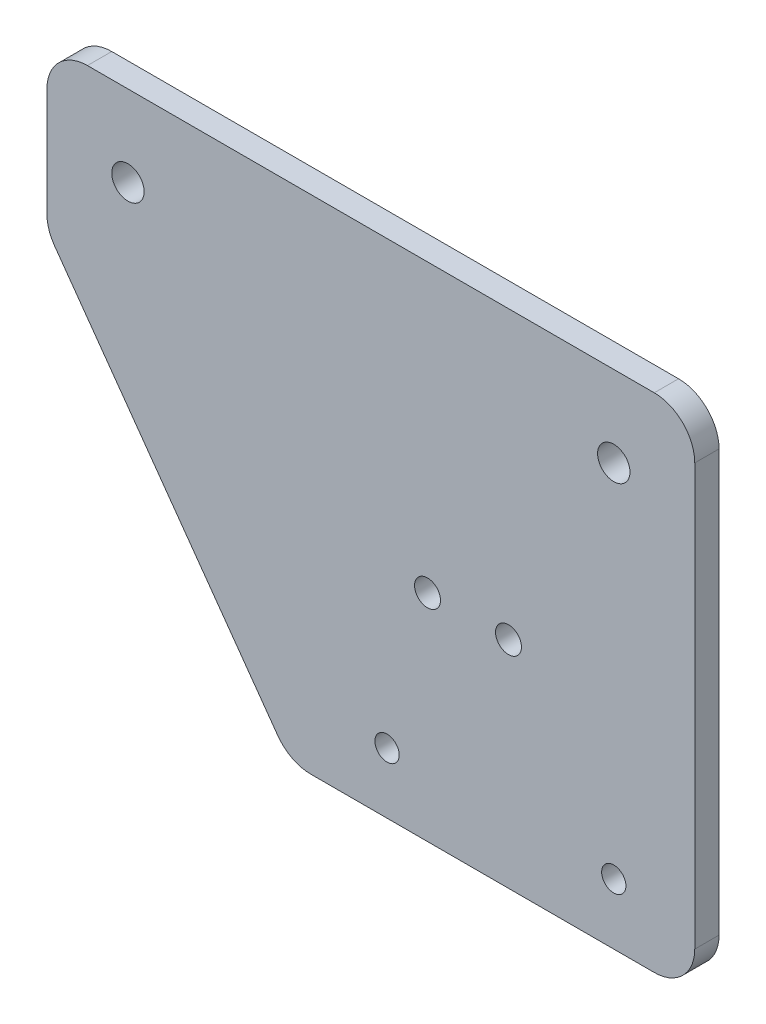
ISO-10303-21;
HEADER;
FILE_DESCRIPTION(('STEP AP214'),'2;1');
FILE_NAME('part.step','',(''),(''),'','','');
FILE_SCHEMA(('AUTOMOTIVE_DESIGN { 1 0 10303 214 1 1 1 1 }'));
ENDSEC;
DATA;
#1=APPLICATION_CONTEXT('core data for automotive mechanical design processes');
#2=APPLICATION_PROTOCOL_DEFINITION('international standard','automotive_design',2000,#1);
#3=PRODUCT_CONTEXT('',#1,'mechanical');
#4=PRODUCT('Part','Part','',(#3));
#5=PRODUCT_RELATED_PRODUCT_CATEGORY('part','',(#4));
#6=PRODUCT_DEFINITION_FORMATION('','',#4);
#7=PRODUCT_DEFINITION_CONTEXT('part definition',#1,'design');
#8=PRODUCT_DEFINITION('design','',#6,#7);
#9=PRODUCT_DEFINITION_SHAPE('','',#8);
#10=(LENGTH_UNIT() NAMED_UNIT(*) SI_UNIT(.MILLI.,.METRE.));
#11=(NAMED_UNIT(*) PLANE_ANGLE_UNIT() SI_UNIT($,.RADIAN.));
#12=(NAMED_UNIT(*) SI_UNIT($,.STERADIAN.) SOLID_ANGLE_UNIT());
#13=UNCERTAINTY_MEASURE_WITH_UNIT(LENGTH_MEASURE(1.E-05),#10,'distance_accuracy_value','');
#14=(GEOMETRIC_REPRESENTATION_CONTEXT(3) GLOBAL_UNCERTAINTY_ASSIGNED_CONTEXT((#13)) GLOBAL_UNIT_ASSIGNED_CONTEXT((#10,
#11,#12)) REPRESENTATION_CONTEXT('',''));
#15=CARTESIAN_POINT('',(0.,0.,0.));
#16=DIRECTION('',(0.,0.,1.));
#17=DIRECTION('',(1.,0.,0.));
#18=AXIS2_PLACEMENT_3D('',#15,#16,#17);
#19=CARTESIAN_POINT('',(37.5,31.,3.));
#20=DIRECTION('',(-1.,0.,0.));
#21=DIRECTION('',(0.,0.,1.));
#22=AXIS2_PLACEMENT_3D('',#19,#20,#21);
#23=PLANE('',#22);
#24=DIRECTION('',(0.,1.,0.));
#25=VECTOR('',#24,1.);
#26=CARTESIAN_POINT('',(37.5,31.,0.));
#27=LINE('',#26,#25);
#28=CARTESIAN_POINT('',(37.5,-26.,0.));
#29=VERTEX_POINT('',#28);
#30=CARTESIAN_POINT('',(37.5,26.,0.));
#31=VERTEX_POINT('',#30);
#32=EDGE_CURVE('E147',#29,#31,#27,.T.);
#33=ORIENTED_EDGE('',*,*,#32,.T.);
#34=DIRECTION('',(0.,0.,-1.));
#35=VECTOR('',#34,1.);
#36=CARTESIAN_POINT('',(37.5,26.,3.));
#37=LINE('',#36,#35);
#38=CARTESIAN_POINT('',(37.5,26.,3.));
#39=VERTEX_POINT('',#38);
#40=EDGE_CURVE('E50',#31,#39,#37,.F.);
#41=ORIENTED_EDGE('',*,*,#40,.T.);
#42=DIRECTION('',(0.,1.,0.));
#43=VECTOR('',#42,1.);
#44=CARTESIAN_POINT('',(37.5,31.,3.));
#45=LINE('',#44,#43);
#46=CARTESIAN_POINT('',(37.5,-26.,3.));
#47=VERTEX_POINT('',#46);
#48=EDGE_CURVE('E145',#47,#39,#45,.T.);
#49=ORIENTED_EDGE('',*,*,#48,.F.);
#50=DIRECTION('',(0.,0.,-1.));
#51=VECTOR('',#50,1.);
#52=CARTESIAN_POINT('',(37.5,-26.,3.));
#53=LINE('',#52,#51);
#54=EDGE_CURVE('E176',#47,#29,#53,.T.);
#55=ORIENTED_EDGE('',*,*,#54,.T.);
#56=EDGE_LOOP('',(#33,#41,#49,#55));
#57=FACE_BOUND('',#56,.T.);
#58=ADVANCED_FACE('F35',(#57),#23,.F.);
#59=CARTESIAN_POINT('',(-42.5,31.,3.));
#60=DIRECTION('',(0.,-1.,0.));
#61=DIRECTION('',(0.,0.,-1.));
#62=AXIS2_PLACEMENT_3D('',#59,#60,#61);
#63=PLANE('',#62);
#64=DIRECTION('',(-1.,0.,0.));
#65=VECTOR('',#64,1.);
#66=CARTESIAN_POINT('',(-42.5,31.,0.));
#67=LINE('',#66,#65);
#68=CARTESIAN_POINT('',(32.5,31.,0.));
#69=VERTEX_POINT('',#68);
#70=CARTESIAN_POINT('',(-37.5,31.,0.));
#71=VERTEX_POINT('',#70);
#72=EDGE_CURVE('E142',#69,#71,#67,.T.);
#73=ORIENTED_EDGE('',*,*,#72,.T.);
#74=DIRECTION('',(0.,0.,-1.));
#75=VECTOR('',#74,1.);
#76=CARTESIAN_POINT('',(-37.5,31.,3.));
#77=LINE('',#76,#75);
#78=CARTESIAN_POINT('',(-37.5,31.,3.));
#79=VERTEX_POINT('',#78);
#80=EDGE_CURVE('E118',#71,#79,#77,.F.);
#81=ORIENTED_EDGE('',*,*,#80,.T.);
#82=DIRECTION('',(-1.,0.,0.));
#83=VECTOR('',#82,1.);
#84=CARTESIAN_POINT('',(-42.5,31.,3.));
#85=LINE('',#84,#83);
#86=CARTESIAN_POINT('',(32.5,31.,3.));
#87=VERTEX_POINT('',#86);
#88=EDGE_CURVE('E232',#87,#79,#85,.T.);
#89=ORIENTED_EDGE('',*,*,#88,.F.);
#90=DIRECTION('',(0.,0.,-1.));
#91=VECTOR('',#90,1.);
#92=CARTESIAN_POINT('',(32.5,31.,3.));
#93=LINE('',#92,#91);
#94=EDGE_CURVE('E123',#87,#69,#93,.T.);
#95=ORIENTED_EDGE('',*,*,#94,.T.);
#96=EDGE_LOOP('',(#73,#81,#89,#95));
#97=FACE_BOUND('',#96,.T.);
#98=ADVANCED_FACE('F242',(#97),#63,.F.);
#99=CARTESIAN_POINT('',(-42.5,31.,3.));
#100=DIRECTION('',(1.,0.,0.));
#101=DIRECTION('',(0.,1.,0.));
#102=AXIS2_PLACEMENT_3D('',#99,#100,#101);
#103=PLANE('',#102);
#104=DIRECTION('',(0.,-1.,0.));
#105=VECTOR('',#104,1.);
#106=CARTESIAN_POINT('',(-42.5,31.,3.));
#107=LINE('',#106,#105);
#108=CARTESIAN_POINT('',(-42.5,26.,3.));
#109=VERTEX_POINT('',#108);
#110=CARTESIAN_POINT('',(-42.5,12.6023252670427,3.));
#111=VERTEX_POINT('',#110);
#112=EDGE_CURVE('E134',#109,#111,#107,.T.);
#113=ORIENTED_EDGE('',*,*,#112,.F.);
#114=DIRECTION('',(0.,0.,-1.));
#115=VECTOR('',#114,1.);
#116=CARTESIAN_POINT('',(-42.5,26.,3.));
#117=LINE('',#116,#115);
#118=CARTESIAN_POINT('',(-42.5,26.,0.));
#119=VERTEX_POINT('',#118);
#120=EDGE_CURVE('E117',#109,#119,#117,.T.);
#121=ORIENTED_EDGE('',*,*,#120,.T.);
#122=DIRECTION('',(0.,-1.,0.));
#123=VECTOR('',#122,1.);
#124=CARTESIAN_POINT('',(-42.5,31.,0.));
#125=LINE('',#124,#123);
#126=CARTESIAN_POINT('',(-42.5,12.6023252670427,0.));
#127=VERTEX_POINT('',#126);
#128=EDGE_CURVE('E131',#119,#127,#125,.T.);
#129=ORIENTED_EDGE('',*,*,#128,.T.);
#130=DIRECTION('',(0.,0.,1.));
#131=VECTOR('',#130,1.);
#132=CARTESIAN_POINT('',(-42.5,12.6023252670427,3.));
#133=LINE('',#132,#131);
#134=EDGE_CURVE('E136',#127,#111,#133,.T.);
#135=ORIENTED_EDGE('',*,*,#134,.T.);
#136=EDGE_LOOP('',(#113,#121,#129,#135));
#137=FACE_BOUND('',#136,.T.);
#138=ADVANCED_FACE('F129',(#137),#103,.F.);
#139=CARTESIAN_POINT('',(-42.5,-31.,3.));
#140=DIRECTION('',(0.,1.,0.));
#141=DIRECTION('',(0.,0.,1.));
#142=AXIS2_PLACEMENT_3D('',#139,#140,#141);
#143=PLANE('',#142);
#144=DIRECTION('',(1.,0.,0.));
#145=VECTOR('',#144,1.);
#146=CARTESIAN_POINT('',(-42.5,-31.,0.));
#147=LINE('',#146,#145);
#148=CARTESIAN_POINT('',(-9.92691052354098,-31.,0.));
#149=VERTEX_POINT('',#148);
#150=CARTESIAN_POINT('',(32.5,-31.,0.));
#151=VERTEX_POINT('',#150);
#152=EDGE_CURVE('E141',#149,#151,#147,.T.);
#153=ORIENTED_EDGE('',*,*,#152,.T.);
#154=DIRECTION('',(0.,0.,-1.));
#155=VECTOR('',#154,1.);
#156=CARTESIAN_POINT('',(32.5,-31.,3.));
#157=LINE('',#156,#155);
#158=CARTESIAN_POINT('',(32.5,-31.,3.));
#159=VERTEX_POINT('',#158);
#160=EDGE_CURVE('E11',#151,#159,#157,.F.);
#161=ORIENTED_EDGE('',*,*,#160,.T.);
#162=DIRECTION('',(1.,0.,0.));
#163=VECTOR('',#162,1.);
#164=CARTESIAN_POINT('',(-42.5,-31.,3.));
#165=LINE('',#164,#163);
#166=CARTESIAN_POINT('',(-9.92691052354098,-31.,3.));
#167=VERTEX_POINT('',#166);
#168=EDGE_CURVE('E151',#167,#159,#165,.T.);
#169=ORIENTED_EDGE('',*,*,#168,.F.);
#170=DIRECTION('',(0.,0.,1.));
#171=VECTOR('',#170,1.);
#172=CARTESIAN_POINT('',(-9.92691052354098,-31.,3.));
#173=LINE('',#172,#171);
#174=EDGE_CURVE('E43',#167,#149,#173,.F.);
#175=ORIENTED_EDGE('',*,*,#174,.T.);
#176=EDGE_LOOP('',(#153,#161,#169,#175));
#177=FACE_BOUND('',#176,.T.);
#178=ADVANCED_FACE('F183',(#177),#143,.F.);
#179=CARTESIAN_POINT('',(0.,0.,3.));
#180=DIRECTION('',(0.,0.,1.));
#181=DIRECTION('',(1.,0.,0.));
#182=AXIS2_PLACEMENT_3D('',#179,#180,#181);
#183=PLANE('',#182);
#184=CARTESIAN_POINT('',(27.5,-23.5,3.));
#185=DIRECTION('',(0.,0.,1.));
#186=DIRECTION('',(1.,0.,0.));
#187=AXIS2_PLACEMENT_3D('',#184,#185,#186);
#188=CIRCLE('',#187,1.49999999999999);
#189=CARTESIAN_POINT('',(29.,-23.5,3.));
#190=VERTEX_POINT('',#189);
#191=EDGE_CURVE('E430',#190,#190,#188,.T.);
#192=ORIENTED_EDGE('',*,*,#191,.F.);
#193=EDGE_LOOP('',(#192));
#194=FACE_BOUND('',#193,.T.);
#195=CARTESIAN_POINT('',(-0.500000000000011,-23.5,3.));
#196=DIRECTION('',(0.,0.,1.));
#197=DIRECTION('',(1.,0.,0.));
#198=AXIS2_PLACEMENT_3D('',#195,#196,#197);
#199=CIRCLE('',#198,1.49999999999999);
#200=CARTESIAN_POINT('',(0.999999999999977,-23.5,3.));
#201=VERTEX_POINT('',#200);
#202=EDGE_CURVE('E205',#201,#201,#199,.T.);
#203=ORIENTED_EDGE('',*,*,#202,.F.);
#204=EDGE_LOOP('',(#203));
#205=FACE_BOUND('',#204,.T.);
#206=ORIENTED_EDGE('',*,*,#88,.T.);
#207=CARTESIAN_POINT('',(-37.5,26.,3.));
#208=DIRECTION('',(0.,0.,1.));
#209=DIRECTION('',(1.,0.,0.));
#210=AXIS2_PLACEMENT_3D('',#207,#208,#209);
#211=CIRCLE('',#210,5.);
#212=EDGE_CURVE('E169',#79,#109,#211,.T.);
#213=ORIENTED_EDGE('',*,*,#212,.T.);
#214=ORIENTED_EDGE('',*,*,#112,.T.);
#215=CARTESIAN_POINT('',(-37.5,12.6023252670427,3.));
#216=DIRECTION('',(0.,0.,1.));
#217=DIRECTION('',(1.,0.,0.));
#218=AXIS2_PLACEMENT_3D('',#215,#216,#217);
#219=CIRCLE('',#218,5.);
#220=CARTESIAN_POINT('',(-41.5686673560337,9.69613429844719,3.));
#221=VERTEX_POINT('',#220);
#222=EDGE_CURVE('E167',#111,#221,#219,.T.);
#223=ORIENTED_EDGE('',*,*,#222,.T.);
#224=DIRECTION('',(-0.581238193719096,0.813733471206735,0.));
#225=VECTOR('',#224,1.);
#226=CARTESIAN_POINT('',(-12.5,-31.,3.));
#227=LINE('',#226,#225);
#228=CARTESIAN_POINT('',(-13.9955778795747,-28.9061909685955,3.));
#229=VERTEX_POINT('',#228);
#230=EDGE_CURVE('E194',#229,#221,#227,.T.);
#231=ORIENTED_EDGE('',*,*,#230,.F.);
#232=CARTESIAN_POINT('',(-9.92691052354098,-26.,3.));
#233=DIRECTION('',(0.,0.,1.));
#234=DIRECTION('',(1.,0.,0.));
#235=AXIS2_PLACEMENT_3D('',#232,#233,#234);
#236=CIRCLE('',#235,5.);
#237=EDGE_CURVE('E162',#229,#167,#236,.T.);
#238=ORIENTED_EDGE('',*,*,#237,.T.);
#239=ORIENTED_EDGE('',*,*,#168,.T.);
#240=CARTESIAN_POINT('',(32.5,-26.,3.));
#241=DIRECTION('',(0.,0.,1.));
#242=DIRECTION('',(1.,0.,0.));
#243=AXIS2_PLACEMENT_3D('',#240,#241,#242);
#244=CIRCLE('',#243,5.);
#245=EDGE_CURVE('E57',#159,#47,#244,.T.);
#246=ORIENTED_EDGE('',*,*,#245,.T.);
#247=ORIENTED_EDGE('',*,*,#48,.T.);
#248=CARTESIAN_POINT('',(32.5,26.,3.));
#249=DIRECTION('',(0.,0.,1.));
#250=DIRECTION('',(1.,0.,0.));
#251=AXIS2_PLACEMENT_3D('',#248,#249,#250);
#252=CIRCLE('',#251,5.);
#253=EDGE_CURVE('E165',#39,#87,#252,.T.);
#254=ORIENTED_EDGE('',*,*,#253,.T.);
#255=EDGE_LOOP('',(#206,#213,#214,#223,#231,#238,#239,#246,#247,#254));
#256=FACE_BOUND('',#255,.T.);
#257=CARTESIAN_POINT('',(14.5,-4.39999999999999,3.));
#258=DIRECTION('',(0.,0.,1.));
#259=DIRECTION('',(1.,0.,0.));
#260=AXIS2_PLACEMENT_3D('',#257,#258,#259);
#261=CIRCLE('',#260,1.6);
#262=CARTESIAN_POINT('',(16.1,-4.39999999999999,3.));
#263=VERTEX_POINT('',#262);
#264=EDGE_CURVE('E202',#263,#263,#261,.T.);
#265=ORIENTED_EDGE('',*,*,#264,.F.);
#266=EDGE_LOOP('',(#265));
#267=FACE_BOUND('',#266,.T.);
#268=CARTESIAN_POINT('',(4.49999999999999,-4.4,3.));
#269=DIRECTION('',(0.,0.,1.));
#270=DIRECTION('',(1.,0.,0.));
#271=AXIS2_PLACEMENT_3D('',#268,#269,#270);
#272=CIRCLE('',#271,1.6);
#273=CARTESIAN_POINT('',(6.09999999999999,-4.4,3.));
#274=VERTEX_POINT('',#273);
#275=EDGE_CURVE('E213',#274,#274,#272,.T.);
#276=ORIENTED_EDGE('',*,*,#275,.F.);
#277=EDGE_LOOP('',(#276));
#278=FACE_BOUND('',#277,.T.);
#279=CARTESIAN_POINT('',(27.5,21.,3.));
#280=DIRECTION('',(0.,0.,1.));
#281=DIRECTION('',(1.,0.,0.));
#282=AXIS2_PLACEMENT_3D('',#279,#280,#281);
#283=CIRCLE('',#282,1.99999999999999);
#284=CARTESIAN_POINT('',(29.5,21.,3.));
#285=VERTEX_POINT('',#284);
#286=EDGE_CURVE('E219',#285,#285,#283,.T.);
#287=ORIENTED_EDGE('',*,*,#286,.F.);
#288=EDGE_LOOP('',(#287));
#289=FACE_BOUND('',#288,.T.);
#290=CARTESIAN_POINT('',(-32.5,21.,3.));
#291=DIRECTION('',(0.,0.,1.));
#292=DIRECTION('',(1.,0.,0.));
#293=AXIS2_PLACEMENT_3D('',#290,#291,#292);
#294=CIRCLE('',#293,1.99999999999999);
#295=CARTESIAN_POINT('',(-30.5,21.,3.));
#296=VERTEX_POINT('',#295);
#297=EDGE_CURVE('E225',#296,#296,#294,.T.);
#298=ORIENTED_EDGE('',*,*,#297,.F.);
#299=EDGE_LOOP('',(#298));
#300=FACE_BOUND('',#299,.T.);
#301=ADVANCED_FACE('F198',(#194,#205,#256,#267,#278,#289,#300),#183,.T.);
#302=CARTESIAN_POINT('',(0.,0.,0.));
#303=DIRECTION('',(0.,0.,1.));
#304=DIRECTION('',(1.,0.,0.));
#305=AXIS2_PLACEMENT_3D('',#302,#303,#304);
#306=PLANE('',#305);
#307=CARTESIAN_POINT('',(27.5,-23.5,0.));
#308=DIRECTION('',(0.,0.,1.));
#309=DIRECTION('',(1.,0.,0.));
#310=AXIS2_PLACEMENT_3D('',#307,#308,#309);
#311=CIRCLE('',#310,1.49999999999999);
#312=CARTESIAN_POINT('',(29.,-23.5,0.));
#313=VERTEX_POINT('',#312);
#314=EDGE_CURVE('E427',#313,#313,#311,.T.);
#315=ORIENTED_EDGE('',*,*,#314,.T.);
#316=EDGE_LOOP('',(#315));
#317=FACE_BOUND('',#316,.T.);
#318=CARTESIAN_POINT('',(-0.500000000000011,-23.5,0.));
#319=DIRECTION('',(0.,0.,1.));
#320=DIRECTION('',(1.,0.,0.));
#321=AXIS2_PLACEMENT_3D('',#318,#319,#320);
#322=CIRCLE('',#321,1.49999999999999);
#323=CARTESIAN_POINT('',(0.999999999999977,-23.5,0.));
#324=VERTEX_POINT('',#323);
#325=EDGE_CURVE('E200',#324,#324,#322,.T.);
#326=ORIENTED_EDGE('',*,*,#325,.T.);
#327=EDGE_LOOP('',(#326));
#328=FACE_BOUND('',#327,.T.);
#329=CARTESIAN_POINT('',(14.5,-4.39999999999999,0.));
#330=DIRECTION('',(0.,0.,1.));
#331=DIRECTION('',(1.,0.,0.));
#332=AXIS2_PLACEMENT_3D('',#329,#330,#331);
#333=CIRCLE('',#332,1.6);
#334=CARTESIAN_POINT('',(16.1,-4.39999999999999,0.));
#335=VERTEX_POINT('',#334);
#336=EDGE_CURVE('E210',#335,#335,#333,.T.);
#337=ORIENTED_EDGE('',*,*,#336,.T.);
#338=EDGE_LOOP('',(#337));
#339=FACE_BOUND('',#338,.T.);
#340=CARTESIAN_POINT('',(4.49999999999999,-4.4,0.));
#341=DIRECTION('',(0.,0.,1.));
#342=DIRECTION('',(1.,0.,0.));
#343=AXIS2_PLACEMENT_3D('',#340,#341,#342);
#344=CIRCLE('',#343,1.6);
#345=CARTESIAN_POINT('',(6.09999999999999,-4.4,0.));
#346=VERTEX_POINT('',#345);
#347=EDGE_CURVE('E216',#346,#346,#344,.T.);
#348=ORIENTED_EDGE('',*,*,#347,.T.);
#349=EDGE_LOOP('',(#348));
#350=FACE_BOUND('',#349,.T.);
#351=CARTESIAN_POINT('',(27.5,21.,0.));
#352=DIRECTION('',(0.,0.,1.));
#353=DIRECTION('',(1.,0.,0.));
#354=AXIS2_PLACEMENT_3D('',#351,#352,#353);
#355=CIRCLE('',#354,2.);
#356=CARTESIAN_POINT('',(29.5,21.,0.));
#357=VERTEX_POINT('',#356);
#358=EDGE_CURVE('E222',#357,#357,#355,.T.);
#359=ORIENTED_EDGE('',*,*,#358,.T.);
#360=EDGE_LOOP('',(#359));
#361=FACE_BOUND('',#360,.T.);
#362=CARTESIAN_POINT('',(-32.5,21.,0.));
#363=DIRECTION('',(0.,0.,1.));
#364=DIRECTION('',(1.,0.,0.));
#365=AXIS2_PLACEMENT_3D('',#362,#363,#364);
#366=CIRCLE('',#365,2.);
#367=CARTESIAN_POINT('',(-30.5,21.,0.));
#368=VERTEX_POINT('',#367);
#369=EDGE_CURVE('E228',#368,#368,#366,.T.);
#370=ORIENTED_EDGE('',*,*,#369,.T.);
#371=EDGE_LOOP('',(#370));
#372=FACE_BOUND('',#371,.T.);
#373=ORIENTED_EDGE('',*,*,#128,.F.);
#374=CARTESIAN_POINT('',(-37.5,26.,0.));
#375=DIRECTION('',(0.,0.,1.));
#376=DIRECTION('',(1.,0.,0.));
#377=AXIS2_PLACEMENT_3D('',#374,#375,#376);
#378=CIRCLE('',#377,5.);
#379=EDGE_CURVE('E113',#119,#71,#378,.F.);
#380=ORIENTED_EDGE('',*,*,#379,.T.);
#381=ORIENTED_EDGE('',*,*,#72,.F.);
#382=CARTESIAN_POINT('',(32.5,26.,0.));
#383=DIRECTION('',(0.,0.,1.));
#384=DIRECTION('',(1.,0.,0.));
#385=AXIS2_PLACEMENT_3D('',#382,#383,#384);
#386=CIRCLE('',#385,5.);
#387=EDGE_CURVE('E156',#69,#31,#386,.F.);
#388=ORIENTED_EDGE('',*,*,#387,.T.);
#389=ORIENTED_EDGE('',*,*,#32,.F.);
#390=CARTESIAN_POINT('',(32.5,-26.,0.));
#391=DIRECTION('',(0.,0.,1.));
#392=DIRECTION('',(1.,0.,0.));
#393=AXIS2_PLACEMENT_3D('',#390,#391,#392);
#394=CIRCLE('',#393,5.);
#395=EDGE_CURVE('E154',#29,#151,#394,.F.);
#396=ORIENTED_EDGE('',*,*,#395,.T.);
#397=ORIENTED_EDGE('',*,*,#152,.F.);
#398=CARTESIAN_POINT('',(-9.92691052354098,-26.,0.));
#399=DIRECTION('',(0.,0.,1.));
#400=DIRECTION('',(1.,0.,0.));
#401=AXIS2_PLACEMENT_3D('',#398,#399,#400);
#402=CIRCLE('',#401,5.);
#403=CARTESIAN_POINT('',(-13.9955778795747,-28.9061909685955,0.));
#404=VERTEX_POINT('',#403);
#405=EDGE_CURVE('E135',#149,#404,#402,.F.);
#406=ORIENTED_EDGE('',*,*,#405,.T.);
#407=DIRECTION('',(-0.581238193719096,0.813733471206735,0.));
#408=VECTOR('',#407,1.);
#409=CARTESIAN_POINT('',(-12.5,-31.,0.));
#410=LINE('',#409,#408);
#411=CARTESIAN_POINT('',(-41.5686673560337,9.69613429844719,0.));
#412=VERTEX_POINT('',#411);
#413=EDGE_CURVE('E196',#404,#412,#410,.T.);
#414=ORIENTED_EDGE('',*,*,#413,.T.);
#415=CARTESIAN_POINT('',(-37.5,12.6023252670427,0.));
#416=DIRECTION('',(0.,0.,1.));
#417=DIRECTION('',(1.,0.,0.));
#418=AXIS2_PLACEMENT_3D('',#415,#416,#417);
#419=CIRCLE('',#418,5.);
#420=EDGE_CURVE('E124',#412,#127,#419,.F.);
#421=ORIENTED_EDGE('',*,*,#420,.T.);
#422=EDGE_LOOP('',(#373,#380,#381,#388,#389,#396,#397,#406,#414,#421));
#423=FACE_BOUND('',#422,.T.);
#424=ADVANCED_FACE('F138',(#317,#328,#339,#350,#361,#372,#423),#306,.F.);
#425=CARTESIAN_POINT('',(-32.5,21.,3.));
#426=DIRECTION('',(0.,0.,1.));
#427=DIRECTION('',(1.,0.,0.));
#428=AXIS2_PLACEMENT_3D('',#425,#426,#427);
#429=CYLINDRICAL_SURFACE('',#428,1.99999999999999);
#430=ORIENTED_EDGE('',*,*,#369,.F.);
#431=EDGE_LOOP('',(#430));
#432=FACE_BOUND('',#431,.T.);
#433=ORIENTED_EDGE('',*,*,#297,.T.);
#434=EDGE_LOOP('',(#433));
#435=FACE_BOUND('',#434,.T.);
#436=ADVANCED_FACE('F315',(#432,#435),#429,.F.);
#437=CARTESIAN_POINT('',(27.5,21.,3.));
#438=DIRECTION('',(0.,0.,1.));
#439=DIRECTION('',(1.,0.,0.));
#440=AXIS2_PLACEMENT_3D('',#437,#438,#439);
#441=CYLINDRICAL_SURFACE('',#440,1.99999999999999);
#442=ORIENTED_EDGE('',*,*,#358,.F.);
#443=EDGE_LOOP('',(#442));
#444=FACE_BOUND('',#443,.T.);
#445=ORIENTED_EDGE('',*,*,#286,.T.);
#446=EDGE_LOOP('',(#445));
#447=FACE_BOUND('',#446,.T.);
#448=ADVANCED_FACE('F375',(#444,#447),#441,.F.);
#449=CARTESIAN_POINT('',(4.49999999999999,-4.4,3.));
#450=DIRECTION('',(0.,0.,1.));
#451=DIRECTION('',(1.,0.,0.));
#452=AXIS2_PLACEMENT_3D('',#449,#450,#451);
#453=CYLINDRICAL_SURFACE('',#452,1.6);
#454=ORIENTED_EDGE('',*,*,#347,.F.);
#455=EDGE_LOOP('',(#454));
#456=FACE_BOUND('',#455,.T.);
#457=ORIENTED_EDGE('',*,*,#275,.T.);
#458=EDGE_LOOP('',(#457));
#459=FACE_BOUND('',#458,.T.);
#460=ADVANCED_FACE('F365',(#456,#459),#453,.F.);
#461=CARTESIAN_POINT('',(14.5,-4.39999999999999,3.));
#462=DIRECTION('',(0.,0.,1.));
#463=DIRECTION('',(1.,0.,0.));
#464=AXIS2_PLACEMENT_3D('',#461,#462,#463);
#465=CYLINDRICAL_SURFACE('',#464,1.6);
#466=ORIENTED_EDGE('',*,*,#336,.F.);
#467=EDGE_LOOP('',(#466));
#468=FACE_BOUND('',#467,.T.);
#469=ORIENTED_EDGE('',*,*,#264,.T.);
#470=EDGE_LOOP('',(#469));
#471=FACE_BOUND('',#470,.T.);
#472=ADVANCED_FACE('F303',(#468,#471),#465,.F.);
#473=CARTESIAN_POINT('',(-12.5,-31.,0.));
#474=DIRECTION('',(0.813733471206735,0.581238193719096,0.));
#475=DIRECTION('',(-0.581238193719096,0.813733471206735,0.));
#476=AXIS2_PLACEMENT_3D('',#473,#474,#475);
#477=PLANE('',#476);
#478=ORIENTED_EDGE('',*,*,#230,.T.);
#479=DIRECTION('',(0.,0.,1.));
#480=VECTOR('',#479,1.);
#481=CARTESIAN_POINT('',(-41.5686673560337,9.69613429844719,0.));
#482=LINE('',#481,#480);
#483=EDGE_CURVE('E174',#221,#412,#482,.F.);
#484=ORIENTED_EDGE('',*,*,#483,.T.);
#485=ORIENTED_EDGE('',*,*,#413,.F.);
#486=DIRECTION('',(0.,0.,1.));
#487=VECTOR('',#486,1.);
#488=CARTESIAN_POINT('',(-13.9955778795747,-28.9061909685955,0.));
#489=LINE('',#488,#487);
#490=EDGE_CURVE('E171',#404,#229,#489,.T.);
#491=ORIENTED_EDGE('',*,*,#490,.T.);
#492=EDGE_LOOP('',(#478,#484,#485,#491));
#493=FACE_BOUND('',#492,.T.);
#494=ADVANCED_FACE('F193',(#493),#477,.F.);
#495=CARTESIAN_POINT('',(-0.500000000000011,-23.5,3.));
#496=DIRECTION('',(0.,0.,1.));
#497=DIRECTION('',(1.,0.,0.));
#498=AXIS2_PLACEMENT_3D('',#495,#496,#497);
#499=CYLINDRICAL_SURFACE('',#498,1.49999999999999);
#500=ORIENTED_EDGE('',*,*,#325,.F.);
#501=EDGE_LOOP('',(#500));
#502=FACE_BOUND('',#501,.T.);
#503=ORIENTED_EDGE('',*,*,#202,.T.);
#504=EDGE_LOOP('',(#503));
#505=FACE_BOUND('',#504,.T.);
#506=ADVANCED_FACE('F302',(#502,#505),#499,.F.);
#507=CARTESIAN_POINT('',(27.5,-23.5,3.));
#508=DIRECTION('',(0.,0.,1.));
#509=DIRECTION('',(1.,0.,0.));
#510=AXIS2_PLACEMENT_3D('',#507,#508,#509);
#511=CYLINDRICAL_SURFACE('',#510,1.49999999999999);
#512=ORIENTED_EDGE('',*,*,#314,.F.);
#513=EDGE_LOOP('',(#512));
#514=FACE_BOUND('',#513,.T.);
#515=ORIENTED_EDGE('',*,*,#191,.T.);
#516=EDGE_LOOP('',(#515));
#517=FACE_BOUND('',#516,.T.);
#518=ADVANCED_FACE('F256',(#514,#517),#511,.F.);
#519=CARTESIAN_POINT('',(-37.5,26.,3.));
#520=DIRECTION('',(0.,0.,-1.));
#521=DIRECTION('',(-1.,0.,0.));
#522=AXIS2_PLACEMENT_3D('',#519,#520,#521);
#523=CYLINDRICAL_SURFACE('',#522,5.);
#524=ORIENTED_EDGE('',*,*,#212,.F.);
#525=ORIENTED_EDGE('',*,*,#80,.F.);
#526=ORIENTED_EDGE('',*,*,#379,.F.);
#527=ORIENTED_EDGE('',*,*,#120,.F.);
#528=EDGE_LOOP('',(#524,#525,#526,#527));
#529=FACE_BOUND('',#528,.T.);
#530=ADVANCED_FACE('F116',(#529),#523,.T.);
#531=CARTESIAN_POINT('',(-37.5,12.6023252670427,3.));
#532=DIRECTION('',(0.,0.,1.));
#533=DIRECTION('',(1.,0.,0.));
#534=AXIS2_PLACEMENT_3D('',#531,#532,#533);
#535=CYLINDRICAL_SURFACE('',#534,5.);
#536=ORIENTED_EDGE('',*,*,#420,.F.);
#537=ORIENTED_EDGE('',*,*,#483,.F.);
#538=ORIENTED_EDGE('',*,*,#222,.F.);
#539=ORIENTED_EDGE('',*,*,#134,.F.);
#540=EDGE_LOOP('',(#536,#537,#538,#539));
#541=FACE_BOUND('',#540,.T.);
#542=ADVANCED_FACE('F255',(#541),#535,.T.);
#543=CARTESIAN_POINT('',(32.5,26.,3.));
#544=DIRECTION('',(0.,0.,-1.));
#545=DIRECTION('',(-1.,0.,0.));
#546=AXIS2_PLACEMENT_3D('',#543,#544,#545);
#547=CYLINDRICAL_SURFACE('',#546,5.);
#548=ORIENTED_EDGE('',*,*,#253,.F.);
#549=ORIENTED_EDGE('',*,*,#40,.F.);
#550=ORIENTED_EDGE('',*,*,#387,.F.);
#551=ORIENTED_EDGE('',*,*,#94,.F.);
#552=EDGE_LOOP('',(#548,#549,#550,#551));
#553=FACE_BOUND('',#552,.T.);
#554=ADVANCED_FACE('F238',(#553),#547,.T.);
#555=CARTESIAN_POINT('',(32.5,-26.,3.));
#556=DIRECTION('',(0.,0.,-1.));
#557=DIRECTION('',(-1.,0.,0.));
#558=AXIS2_PLACEMENT_3D('',#555,#556,#557);
#559=CYLINDRICAL_SURFACE('',#558,5.);
#560=ORIENTED_EDGE('',*,*,#245,.F.);
#561=ORIENTED_EDGE('',*,*,#160,.F.);
#562=ORIENTED_EDGE('',*,*,#395,.F.);
#563=ORIENTED_EDGE('',*,*,#54,.F.);
#564=EDGE_LOOP('',(#560,#561,#562,#563));
#565=FACE_BOUND('',#564,.T.);
#566=ADVANCED_FACE('F261',(#565),#559,.T.);
#567=CARTESIAN_POINT('',(-9.92691052354098,-26.,0.));
#568=DIRECTION('',(0.,0.,1.));
#569=DIRECTION('',(1.,0.,0.));
#570=AXIS2_PLACEMENT_3D('',#567,#568,#569);
#571=CYLINDRICAL_SURFACE('',#570,5.);
#572=ORIENTED_EDGE('',*,*,#405,.F.);
#573=ORIENTED_EDGE('',*,*,#174,.F.);
#574=ORIENTED_EDGE('',*,*,#237,.F.);
#575=ORIENTED_EDGE('',*,*,#490,.F.);
#576=EDGE_LOOP('',(#572,#573,#574,#575));
#577=FACE_BOUND('',#576,.T.);
#578=ADVANCED_FACE('F37',(#577),#571,.T.);
#579=CLOSED_SHELL('',(#58,#98,#138,#178,#301,#424,#436,#448,#460,#472,#494,#506,#518,#530,#542,
#554,#566,#578));
#580=MANIFOLD_SOLID_BREP('B2',#579);
#581=ADVANCED_BREP_SHAPE_REPRESENTATION('',(#18,#580),#14);
#582=SHAPE_DEFINITION_REPRESENTATION(#9,#581);
ENDSEC;
END-ISO-10303-21;
